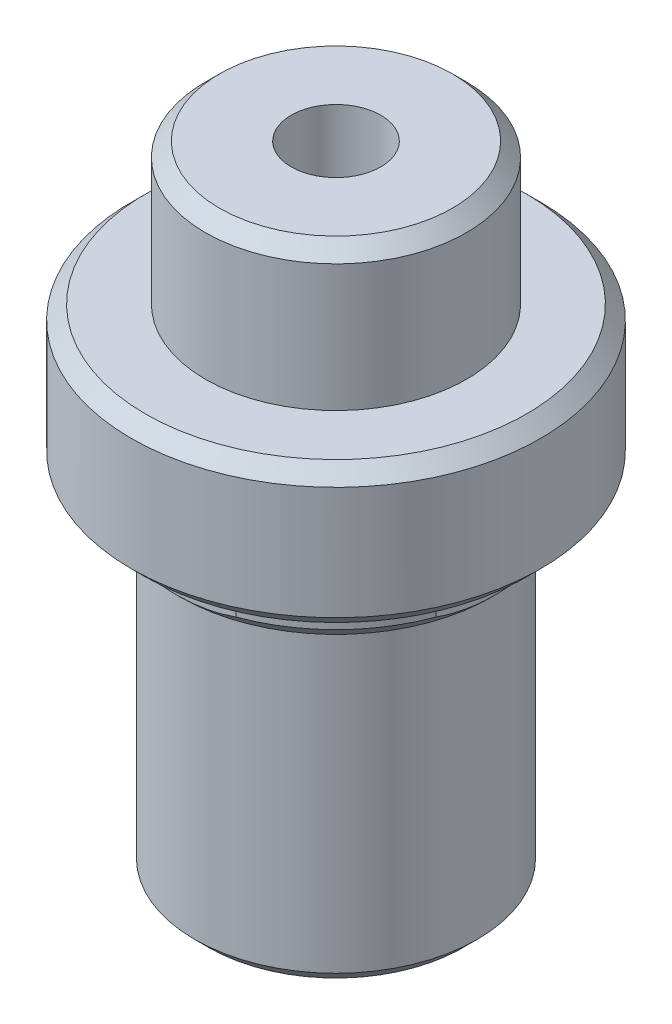
ISO-10303-21;
HEADER;
FILE_DESCRIPTION(('STEP AP214'),'2;1');
FILE_NAME('part.step','',(''),(''),'','','');
FILE_SCHEMA(('AUTOMOTIVE_DESIGN { 1 0 10303 214 1 1 1 1 }'));
ENDSEC;
DATA;
#1=APPLICATION_CONTEXT('core data for automotive mechanical design processes');
#2=APPLICATION_PROTOCOL_DEFINITION('international standard','automotive_design',2000,#1);
#3=PRODUCT_CONTEXT('',#1,'mechanical');
#4=PRODUCT('Part','Part','',(#3));
#5=PRODUCT_RELATED_PRODUCT_CATEGORY('part','',(#4));
#6=PRODUCT_DEFINITION_FORMATION('','',#4);
#7=PRODUCT_DEFINITION_CONTEXT('part definition',#1,'design');
#8=PRODUCT_DEFINITION('design','',#6,#7);
#9=PRODUCT_DEFINITION_SHAPE('','',#8);
#10=(LENGTH_UNIT() NAMED_UNIT(*) SI_UNIT(.MILLI.,.METRE.));
#11=(NAMED_UNIT(*) PLANE_ANGLE_UNIT() SI_UNIT($,.RADIAN.));
#12=(NAMED_UNIT(*) SI_UNIT($,.STERADIAN.) SOLID_ANGLE_UNIT());
#13=UNCERTAINTY_MEASURE_WITH_UNIT(LENGTH_MEASURE(1.E-05),#10,'distance_accuracy_value','');
#14=(GEOMETRIC_REPRESENTATION_CONTEXT(3) GLOBAL_UNCERTAINTY_ASSIGNED_CONTEXT((#13)) GLOBAL_UNIT_ASSIGNED_CONTEXT((#10,
#11,#12)) REPRESENTATION_CONTEXT('',''));
#15=CARTESIAN_POINT('',(0.,0.,0.));
#16=DIRECTION('',(0.,0.,1.));
#17=DIRECTION('',(1.,0.,0.));
#18=AXIS2_PLACEMENT_3D('',#15,#16,#17);
#19=CARTESIAN_POINT('',(0.,38.2504155517242,0.));
#20=DIRECTION('',(0.,1.,0.));
#21=DIRECTION('',(0.,0.,1.));
#22=AXIS2_PLACEMENT_3D('',#19,#20,#21);
#23=CYLINDRICAL_SURFACE('',#22,24.);
#24=CARTESIAN_POINT('',(0.,-23.,0.));
#25=DIRECTION('',(0.,1.,0.));
#26=DIRECTION('',(0.,0.,1.));
#27=AXIS2_PLACEMENT_3D('',#24,#25,#26);
#28=CIRCLE('',#27,24.);
#29=CARTESIAN_POINT('',(-22.5,-23.,8.35164654424505));
#30=VERTEX_POINT('',#29);
#31=CARTESIAN_POINT('',(-8.35164654424505,-23.,22.5));
#32=VERTEX_POINT('',#31);
#33=EDGE_CURVE('E127',#30,#32,#28,.T.);
#34=ORIENTED_EDGE('',*,*,#33,.T.);
#35=DIRECTION('',(0.,1.,0.));
#36=VECTOR('',#35,1.);
#37=CARTESIAN_POINT('',(-8.35164654424507,38.2504155517242,22.5));
#38=LINE('',#37,#36);
#39=CARTESIAN_POINT('',(-8.35164654424506,-20.,22.5));
#40=VERTEX_POINT('',#39);
#41=EDGE_CURVE('E48',#32,#40,#38,.T.);
#42=ORIENTED_EDGE('',*,*,#41,.T.);
#43=CARTESIAN_POINT('',(0.,-20.,0.));
#44=DIRECTION('',(0.,1.,0.));
#45=DIRECTION('',(0.,0.,1.));
#46=AXIS2_PLACEMENT_3D('',#43,#44,#45);
#47=CIRCLE('',#46,24.);
#48=CARTESIAN_POINT('',(-22.5,-20.,8.35164654424507));
#49=VERTEX_POINT('',#48);
#50=EDGE_CURVE('E128',#49,#40,#47,.T.);
#51=ORIENTED_EDGE('',*,*,#50,.F.);
#52=DIRECTION('',(0.,1.,0.));
#53=VECTOR('',#52,1.);
#54=CARTESIAN_POINT('',(-22.5,38.2504155517242,8.35164654424507));
#55=LINE('',#54,#53);
#56=EDGE_CURVE('E243',#49,#30,#55,.F.);
#57=ORIENTED_EDGE('',*,*,#56,.T.);
#58=EDGE_LOOP('',(#34,#42,#51,#57));
#59=FACE_BOUND('',#58,.T.);
#60=ADVANCED_FACE('F33',(#59),#23,.T.);
#61=CARTESIAN_POINT('',(-8.35164654424505,-23.,-22.5));
#62=VERTEX_POINT('',#61);
#63=CARTESIAN_POINT('',(-22.5,-23.,-8.35164654424505));
#64=VERTEX_POINT('',#63);
#65=EDGE_CURVE('E283',#62,#64,#28,.T.);
#66=ORIENTED_EDGE('',*,*,#65,.T.);
#67=DIRECTION('',(0.,1.,0.));
#68=VECTOR('',#67,1.);
#69=CARTESIAN_POINT('',(-22.5,38.2504155517242,-8.35164654424507));
#70=LINE('',#69,#68);
#71=CARTESIAN_POINT('',(-22.5,-20.,-8.35164654424506));
#72=VERTEX_POINT('',#71);
#73=EDGE_CURVE('E56',#64,#72,#70,.T.);
#74=ORIENTED_EDGE('',*,*,#73,.T.);
#75=CARTESIAN_POINT('',(-8.35164654424506,-20.,-22.5));
#76=VERTEX_POINT('',#75);
#77=EDGE_CURVE('E125',#76,#72,#47,.T.);
#78=ORIENTED_EDGE('',*,*,#77,.F.);
#79=DIRECTION('',(0.,1.,0.));
#80=VECTOR('',#79,1.);
#81=CARTESIAN_POINT('',(-8.35164654424507,38.2504155517242,-22.5));
#82=LINE('',#81,#80);
#83=EDGE_CURVE('E291',#76,#62,#82,.F.);
#84=ORIENTED_EDGE('',*,*,#83,.T.);
#85=EDGE_LOOP('',(#66,#74,#78,#84));
#86=FACE_BOUND('',#85,.T.);
#87=ADVANCED_FACE('F177',(#86),#23,.T.);
#88=CARTESIAN_POINT('',(22.5,-23.,-8.35164654424507));
#89=VERTEX_POINT('',#88);
#90=CARTESIAN_POINT('',(8.35164654424505,-23.,-22.5));
#91=VERTEX_POINT('',#90);
#92=EDGE_CURVE('E138',#89,#91,#28,.T.);
#93=ORIENTED_EDGE('',*,*,#92,.T.);
#94=DIRECTION('',(0.,1.,0.));
#95=VECTOR('',#94,1.);
#96=CARTESIAN_POINT('',(8.35164654424507,38.2504155517242,-22.5));
#97=LINE('',#96,#95);
#98=CARTESIAN_POINT('',(8.35164654424507,-20.,-22.5));
#99=VERTEX_POINT('',#98);
#100=EDGE_CURVE('E124',#91,#99,#97,.T.);
#101=ORIENTED_EDGE('',*,*,#100,.T.);
#102=CARTESIAN_POINT('',(22.5,-20.,-8.35164654424507));
#103=VERTEX_POINT('',#102);
#104=EDGE_CURVE('E117',#103,#99,#47,.T.);
#105=ORIENTED_EDGE('',*,*,#104,.F.);
#106=DIRECTION('',(0.,1.,0.));
#107=VECTOR('',#106,1.);
#108=CARTESIAN_POINT('',(22.5,38.2504155517242,-8.35164654424508));
#109=LINE('',#108,#107);
#110=EDGE_CURVE('E97',#103,#89,#109,.F.);
#111=ORIENTED_EDGE('',*,*,#110,.T.);
#112=EDGE_LOOP('',(#93,#101,#105,#111));
#113=FACE_BOUND('',#112,.T.);
#114=ADVANCED_FACE('F123',(#113),#23,.T.);
#115=CARTESIAN_POINT('',(18.5,0.,0.));
#116=DIRECTION('',(0.,-1.,0.));
#117=DIRECTION('',(0.,0.,-1.));
#118=AXIS2_PLACEMENT_3D('',#115,#116,#117);
#119=PLANE('',#118);
#120=CARTESIAN_POINT('',(0.,0.,0.));
#121=DIRECTION('',(0.,-1.,0.));
#122=DIRECTION('',(0.,0.,-1.));
#123=AXIS2_PLACEMENT_3D('',#120,#121,#122);
#124=CIRCLE('',#123,27.);
#125=CARTESIAN_POINT('',(0.,0.,-27.));
#126=VERTEX_POINT('',#125);
#127=EDGE_CURVE('E156',#126,#126,#124,.F.);
#128=ORIENTED_EDGE('',*,*,#127,.T.);
#129=EDGE_LOOP('',(#128));
#130=FACE_BOUND('',#129,.T.);
#131=CARTESIAN_POINT('',(0.,0.,0.));
#132=DIRECTION('',(0.,1.,0.));
#133=DIRECTION('',(0.,0.,1.));
#134=AXIS2_PLACEMENT_3D('',#131,#132,#133);
#135=CIRCLE('',#134,18.5);
#136=CARTESIAN_POINT('',(0.,0.,18.5));
#137=VERTEX_POINT('',#136);
#138=EDGE_CURVE('E264',#137,#137,#135,.T.);
#139=ORIENTED_EDGE('',*,*,#138,.F.);
#140=EDGE_LOOP('',(#139));
#141=FACE_BOUND('',#140,.T.);
#142=ADVANCED_FACE('F198',(#130,#141),#119,.F.);
#143=CARTESIAN_POINT('',(0.,38.2504155517242,0.));
#144=DIRECTION('',(0.,1.,0.));
#145=DIRECTION('',(0.,0.,1.));
#146=AXIS2_PLACEMENT_3D('',#143,#144,#145);
#147=CYLINDRICAL_SURFACE('',#146,29.);
#148=CARTESIAN_POINT('',(0.,-18.,0.));
#149=DIRECTION('',(0.,1.,0.));
#150=DIRECTION('',(0.,0.,1.));
#151=AXIS2_PLACEMENT_3D('',#148,#149,#150);
#152=CIRCLE('',#151,29.);
#153=CARTESIAN_POINT('',(0.,-18.,29.));
#154=VERTEX_POINT('',#153);
#155=EDGE_CURVE('E144',#154,#154,#152,.T.);
#156=ORIENTED_EDGE('',*,*,#155,.T.);
#157=EDGE_LOOP('',(#156));
#158=FACE_BOUND('',#157,.T.);
#159=CARTESIAN_POINT('',(0.,-2.,0.));
#160=DIRECTION('',(0.,-1.,0.));
#161=DIRECTION('',(0.,0.,-1.));
#162=AXIS2_PLACEMENT_3D('',#159,#160,#161);
#163=CIRCLE('',#162,29.);
#164=CARTESIAN_POINT('',(0.,-2.,-29.));
#165=VERTEX_POINT('',#164);
#166=EDGE_CURVE('E141',#165,#165,#163,.T.);
#167=ORIENTED_EDGE('',*,*,#166,.T.);
#168=EDGE_LOOP('',(#167));
#169=FACE_BOUND('',#168,.T.);
#170=ADVANCED_FACE('F196',(#158,#169),#147,.T.);
#171=CARTESIAN_POINT('',(29.,-20.,0.));
#172=DIRECTION('',(0.,1.,0.));
#173=DIRECTION('',(0.,0.,1.));
#174=AXIS2_PLACEMENT_3D('',#171,#172,#173);
#175=PLANE('',#174);
#176=DIRECTION('',(-1.,0.,0.));
#177=VECTOR('',#176,1.);
#178=CARTESIAN_POINT('',(22.5,-20.,22.5));
#179=LINE('',#178,#177);
#180=CARTESIAN_POINT('',(8.35164654424507,-20.,22.5));
#181=VERTEX_POINT('',#180);
#182=EDGE_CURVE('E279',#181,#40,#179,.T.);
#183=ORIENTED_EDGE('',*,*,#182,.F.);
#184=CARTESIAN_POINT('',(22.5,-20.,8.35164654424507));
#185=VERTEX_POINT('',#184);
#186=EDGE_CURVE('E119',#181,#185,#47,.T.);
#187=ORIENTED_EDGE('',*,*,#186,.T.);
#188=DIRECTION('',(0.,0.,1.));
#189=VECTOR('',#188,1.);
#190=CARTESIAN_POINT('',(22.5,-20.,22.5));
#191=LINE('',#190,#189);
#192=EDGE_CURVE('E100',#103,#185,#191,.T.);
#193=ORIENTED_EDGE('',*,*,#192,.F.);
#194=ORIENTED_EDGE('',*,*,#104,.T.);
#195=DIRECTION('',(1.,0.,0.));
#196=VECTOR('',#195,1.);
#197=CARTESIAN_POINT('',(22.5,-20.,-22.5));
#198=LINE('',#197,#196);
#199=EDGE_CURVE('E120',#76,#99,#198,.T.);
#200=ORIENTED_EDGE('',*,*,#199,.F.);
#201=ORIENTED_EDGE('',*,*,#77,.T.);
#202=DIRECTION('',(0.,0.,-1.));
#203=VECTOR('',#202,1.);
#204=CARTESIAN_POINT('',(-22.5,-20.,22.5));
#205=LINE('',#204,#203);
#206=EDGE_CURVE('E280',#49,#72,#205,.T.);
#207=ORIENTED_EDGE('',*,*,#206,.F.);
#208=ORIENTED_EDGE('',*,*,#50,.T.);
#209=EDGE_LOOP('',(#183,#187,#193,#194,#200,#201,#207,#208));
#210=FACE_BOUND('',#209,.T.);
#211=CARTESIAN_POINT('',(0.,-20.,0.));
#212=DIRECTION('',(0.,1.,0.));
#213=DIRECTION('',(0.,0.,1.));
#214=AXIS2_PLACEMENT_3D('',#211,#212,#213);
#215=CIRCLE('',#214,27.);
#216=CARTESIAN_POINT('',(0.,-20.,27.));
#217=VERTEX_POINT('',#216);
#218=EDGE_CURVE('E147',#217,#217,#215,.F.);
#219=ORIENTED_EDGE('',*,*,#218,.T.);
#220=EDGE_LOOP('',(#219));
#221=FACE_BOUND('',#220,.T.);
#222=ADVANCED_FACE('F114',(#210,#221),#175,.F.);
#223=ORIENTED_EDGE('',*,*,#186,.F.);
#224=DIRECTION('',(0.,1.,0.));
#225=VECTOR('',#224,1.);
#226=CARTESIAN_POINT('',(8.35164654424507,38.2504155517242,22.5));
#227=LINE('',#226,#225);
#228=CARTESIAN_POINT('',(8.35164654424505,-23.,22.5));
#229=VERTEX_POINT('',#228);
#230=EDGE_CURVE('E260',#181,#229,#227,.F.);
#231=ORIENTED_EDGE('',*,*,#230,.T.);
#232=CARTESIAN_POINT('',(22.5,-23.,8.35164654424506));
#233=VERTEX_POINT('',#232);
#234=EDGE_CURVE('E134',#229,#233,#28,.T.);
#235=ORIENTED_EDGE('',*,*,#234,.T.);
#236=DIRECTION('',(0.,1.,0.));
#237=VECTOR('',#236,1.);
#238=CARTESIAN_POINT('',(22.5,38.2504155517242,8.35164654424507));
#239=LINE('',#238,#237);
#240=EDGE_CURVE('E108',#233,#185,#239,.T.);
#241=ORIENTED_EDGE('',*,*,#240,.T.);
#242=EDGE_LOOP('',(#223,#231,#235,#241));
#243=FACE_BOUND('',#242,.T.);
#244=ADVANCED_FACE('F180',(#243),#23,.T.);
#245=CARTESIAN_POINT('',(24.,-25.,0.));
#246=DIRECTION('',(0.,1.,0.));
#247=DIRECTION('',(0.,0.,1.));
#248=AXIS2_PLACEMENT_3D('',#245,#246,#247);
#249=PLANE('',#248);
#250=CARTESIAN_POINT('',(0.,-25.,0.));
#251=DIRECTION('',(0.,1.,0.));
#252=DIRECTION('',(0.,0.,1.));
#253=AXIS2_PLACEMENT_3D('',#250,#251,#252);
#254=CIRCLE('',#253,22.);
#255=CARTESIAN_POINT('',(0.,-25.,22.));
#256=VERTEX_POINT('',#255);
#257=EDGE_CURVE('E137',#256,#256,#254,.F.);
#258=ORIENTED_EDGE('',*,*,#257,.T.);
#259=EDGE_LOOP('',(#258));
#260=FACE_BOUND('',#259,.T.);
#261=CARTESIAN_POINT('',(0.,-25.,0.));
#262=DIRECTION('',(0.,1.,0.));
#263=DIRECTION('',(0.,0.,1.));
#264=AXIS2_PLACEMENT_3D('',#261,#262,#263);
#265=CIRCLE('',#264,20.);
#266=CARTESIAN_POINT('',(0.,-25.,20.));
#267=VERTEX_POINT('',#266);
#268=EDGE_CURVE('E132',#267,#267,#265,.T.);
#269=ORIENTED_EDGE('',*,*,#268,.T.);
#270=EDGE_LOOP('',(#269));
#271=FACE_BOUND('',#270,.T.);
#272=ADVANCED_FACE('F189',(#260,#271),#249,.F.);
#273=CARTESIAN_POINT('',(0.,38.2504155517242,0.));
#274=DIRECTION('',(0.,1.,0.));
#275=DIRECTION('',(0.,0.,1.));
#276=AXIS2_PLACEMENT_3D('',#273,#274,#275);
#277=CYLINDRICAL_SURFACE('',#276,20.);
#278=CARTESIAN_POINT('',(0.,-68.,0.));
#279=DIRECTION('',(0.,1.,0.));
#280=DIRECTION('',(0.,0.,1.));
#281=AXIS2_PLACEMENT_3D('',#278,#279,#280);
#282=CIRCLE('',#281,20.);
#283=CARTESIAN_POINT('',(0.,-68.,20.));
#284=VERTEX_POINT('',#283);
#285=EDGE_CURVE('E41',#284,#284,#282,.T.);
#286=ORIENTED_EDGE('',*,*,#285,.T.);
#287=EDGE_LOOP('',(#286));
#288=FACE_BOUND('',#287,.T.);
#289=ORIENTED_EDGE('',*,*,#268,.F.);
#290=EDGE_LOOP('',(#289));
#291=FACE_BOUND('',#290,.T.);
#292=ADVANCED_FACE('F161',(#288,#291),#277,.T.);
#293=CARTESIAN_POINT('',(20.,-70.,0.));
#294=DIRECTION('',(0.,1.,0.));
#295=DIRECTION('',(0.,0.,1.));
#296=AXIS2_PLACEMENT_3D('',#293,#294,#295);
#297=PLANE('',#296);
#298=CARTESIAN_POINT('',(0.,-70.,0.));
#299=DIRECTION('',(0.,1.,0.));
#300=DIRECTION('',(0.,0.,1.));
#301=AXIS2_PLACEMENT_3D('',#298,#299,#300);
#302=CIRCLE('',#301,18.);
#303=CARTESIAN_POINT('',(0.,-70.,18.));
#304=VERTEX_POINT('',#303);
#305=EDGE_CURVE('E12',#304,#304,#302,.F.);
#306=ORIENTED_EDGE('',*,*,#305,.T.);
#307=EDGE_LOOP('',(#306));
#308=FACE_BOUND('',#307,.T.);
#309=CARTESIAN_POINT('',(0.,-70.,0.));
#310=DIRECTION('',(0.,1.,0.));
#311=DIRECTION('',(0.,0.,1.));
#312=AXIS2_PLACEMENT_3D('',#309,#310,#311);
#313=CIRCLE('',#312,6.35000000000001);
#314=CARTESIAN_POINT('',(0.,-70.,6.35000000000001));
#315=VERTEX_POINT('',#314);
#316=EDGE_CURVE('E269',#315,#315,#313,.T.);
#317=ORIENTED_EDGE('',*,*,#316,.T.);
#318=EDGE_LOOP('',(#317));
#319=FACE_BOUND('',#318,.T.);
#320=ADVANCED_FACE('F395',(#308,#319),#297,.F.);
#321=CARTESIAN_POINT('',(0.,38.2504155517242,0.));
#322=DIRECTION('',(0.,1.,0.));
#323=DIRECTION('',(0.,0.,1.));
#324=AXIS2_PLACEMENT_3D('',#321,#322,#323);
#325=CYLINDRICAL_SURFACE('',#324,6.35000000000001);
#326=ORIENTED_EDGE('',*,*,#316,.F.);
#327=EDGE_LOOP('',(#326));
#328=FACE_BOUND('',#327,.T.);
#329=CARTESIAN_POINT('',(0.,20.,0.));
#330=DIRECTION('',(0.,1.,0.));
#331=DIRECTION('',(0.,0.,1.));
#332=AXIS2_PLACEMENT_3D('',#329,#330,#331);
#333=CIRCLE('',#332,6.35);
#334=CARTESIAN_POINT('',(0.,20.,6.35));
#335=VERTEX_POINT('',#334);
#336=EDGE_CURVE('E267',#335,#335,#333,.T.);
#337=ORIENTED_EDGE('',*,*,#336,.T.);
#338=EDGE_LOOP('',(#337));
#339=FACE_BOUND('',#338,.T.);
#340=ADVANCED_FACE('F386',(#328,#339),#325,.F.);
#341=CARTESIAN_POINT('',(18.5,20.,0.));
#342=DIRECTION('',(0.,-1.,0.));
#343=DIRECTION('',(0.,0.,-1.));
#344=AXIS2_PLACEMENT_3D('',#341,#342,#343);
#345=PLANE('',#344);
#346=CARTESIAN_POINT('',(0.,20.,0.));
#347=DIRECTION('',(0.,-1.,0.));
#348=DIRECTION('',(0.,0.,-1.));
#349=AXIS2_PLACEMENT_3D('',#346,#347,#348);
#350=CIRCLE('',#349,16.5);
#351=CARTESIAN_POINT('',(0.,20.,-16.5));
#352=VERTEX_POINT('',#351);
#353=EDGE_CURVE('E150',#352,#352,#350,.F.);
#354=ORIENTED_EDGE('',*,*,#353,.T.);
#355=EDGE_LOOP('',(#354));
#356=FACE_BOUND('',#355,.T.);
#357=ORIENTED_EDGE('',*,*,#336,.F.);
#358=EDGE_LOOP('',(#357));
#359=FACE_BOUND('',#358,.T.);
#360=ADVANCED_FACE('F378',(#356,#359),#345,.F.);
#361=CARTESIAN_POINT('',(0.,38.2504155517242,0.));
#362=DIRECTION('',(0.,1.,0.));
#363=DIRECTION('',(0.,0.,1.));
#364=AXIS2_PLACEMENT_3D('',#361,#362,#363);
#365=CYLINDRICAL_SURFACE('',#364,18.5);
#366=CARTESIAN_POINT('',(0.,18.,0.));
#367=DIRECTION('',(0.,-1.,0.));
#368=DIRECTION('',(0.,0.,-1.));
#369=AXIS2_PLACEMENT_3D('',#366,#367,#368);
#370=CIRCLE('',#369,18.5);
#371=CARTESIAN_POINT('',(0.,18.,-18.5));
#372=VERTEX_POINT('',#371);
#373=EDGE_CURVE('E153',#372,#372,#370,.T.);
#374=ORIENTED_EDGE('',*,*,#373,.T.);
#375=EDGE_LOOP('',(#374));
#376=FACE_BOUND('',#375,.T.);
#377=ORIENTED_EDGE('',*,*,#138,.T.);
#378=EDGE_LOOP('',(#377));
#379=FACE_BOUND('',#378,.T.);
#380=ADVANCED_FACE('F216',(#376,#379),#365,.T.);
#381=CARTESIAN_POINT('',(0.,-23.,0.));
#382=DIRECTION('',(0.,1.,0.));
#383=DIRECTION('',(0.,0.,1.));
#384=AXIS2_PLACEMENT_3D('',#381,#382,#383);
#385=CONICAL_SURFACE('',#384,24.,0.785398163397447);
#386=CARTESIAN_POINT('',(-15.9474225557246,-19.421561208603,22.5));
#387=CARTESIAN_POINT('',(-15.5441616958929,-19.654717834168,22.5));
#388=CARTESIAN_POINT('',(-15.138351368261,-19.8835233484101,22.5));
#389=CARTESIAN_POINT('',(-14.3211321867447,-20.3311517845097,22.5));
#390=CARTESIAN_POINT('',(-13.9097219161934,-20.5499721170161,22.5));
#391=CARTESIAN_POINT('',(-13.0793554682314,-20.9770796427663,22.5));
#392=CARTESIAN_POINT('',(-12.6603757109975,-21.1853212636151,22.5));
#393=CARTESIAN_POINT('',(-11.8162171168862,-21.5886736563532,22.5));
#394=CARTESIAN_POINT('',(-11.3910387076603,-21.7837853289242,22.5));
#395=CARTESIAN_POINT('',(-10.092170918544,-22.3526980606216,22.5));
#396=CARTESIAN_POINT('',(-9.20797530947142,-22.7033524002016,22.5));
#397=CARTESIAN_POINT('',(-7.86189686472575,-23.1697082620276,22.5));
#398=CARTESIAN_POINT('',(-7.41020785978673,-23.3151470738479,22.5));
#399=CARTESIAN_POINT('',(-6.5003108574941,-23.5838706541361,22.5));
#400=CARTESIAN_POINT('',(-6.04210387002332,-23.7071588150894,22.5));
#401=CARTESIAN_POINT('',(-5.02097342893619,-23.9529816896216,22.5));
#402=CARTESIAN_POINT('',(-4.45663128002564,-24.0697052076643,22.5));
#403=CARTESIAN_POINT('',(-3.32103619542194,-24.2631062280958,22.5));
#404=CARTESIAN_POINT('',(-2.74978292531642,-24.3397817846673,22.5));
#405=CARTESIAN_POINT('',(-1.6078291329521,-24.4497243192446,22.5));
#406=CARTESIAN_POINT('',(-1.03716306765522,-24.4833448455699,22.5));
#407=CARTESIAN_POINT('',(0.105078963696198,-24.5070030698748,22.5));
#408=CARTESIAN_POINT('',(0.676654950369737,-24.4970397657691,22.5));
#409=CARTESIAN_POINT('',(1.90450301987357,-24.4290774552485,22.5));
#410=CARTESIAN_POINT('',(2.56038821431331,-24.3639795320554,22.5));
#411=CARTESIAN_POINT('',(3.86450606988731,-24.1796758462308,22.5));
#412=CARTESIAN_POINT('',(4.51273716978307,-24.060459233913,22.5));
#413=CARTESIAN_POINT('',(5.80615982682855,-23.7715911767705,22.5));
#414=CARTESIAN_POINT('',(6.45121456982356,-23.6013340337506,22.5));
#415=CARTESIAN_POINT('',(7.72803223340048,-23.2176206197606,22.5));
#416=CARTESIAN_POINT('',(8.35979787917189,-23.00417330303,22.5));
#417=CARTESIAN_POINT('',(9.79928736203335,-22.4703573528159,22.5));
#418=CARTESIAN_POINT('',(10.60224596659,-22.1371965073843,22.5));
#419=CARTESIAN_POINT('',(12.1861171541319,-21.4216546828632,22.5));
#420=CARTESIAN_POINT('',(12.9670174553623,-21.039246917707,22.5));
#421=CARTESIAN_POINT('',(14.5113278006179,-20.2344839840316,22.5));
#422=CARTESIAN_POINT('',(15.2746658068828,-19.8119916501419,22.5));
#423=CARTESIAN_POINT('',(16.783386030616,-18.9365949059687,22.5));
#424=CARTESIAN_POINT('',(17.5287715715768,-18.4836961844615,22.5));
#425=CARTESIAN_POINT('',(18.9693996082436,-17.5756812099162,22.5));
#426=CARTESIAN_POINT('',(19.6653480088507,-17.1216791596362,22.5));
#427=CARTESIAN_POINT('',(21.045339596218,-16.195867979536,22.5));
#428=CARTESIAN_POINT('',(21.7293818059876,-15.7240573983663,22.5));
#429=CARTESIAN_POINT('',(23.0813221736851,-14.7700438758726,22.5));
#430=CARTESIAN_POINT('',(23.7493087523486,-14.2879659433174,22.5));
#431=CARTESIAN_POINT('',(24.7446600376196,-13.5560502804662,22.5));
#432=CARTESIAN_POINT('',(25.0752971585477,-13.3106438913869,22.5));
#433=CARTESIAN_POINT('',(25.7345383358528,-12.8171277455712,22.5));
#434=CARTESIAN_POINT('',(26.0631424307725,-12.5690180403329,22.5));
#435=CARTESIAN_POINT('',(26.3908098246762,-12.3196764259296,22.5));
#436=B_SPLINE_CURVE_WITH_KNOTS('',3,(#386,#387,#388,#389,#390,#391,#392,#393,#394,#395,#396,
#397,#398,#399,#400,#401,#402,#403,#404,#405,#406,#407,#408,#409,#410,#411,#412,#413,#414,#415,
#416,#417,#418,#419,#420,#421,#422,#423,#424,#425,#426,#427,#428,#429,#430,#431,#432,#433,#434,
#435),.UNSPECIFIED.,.F.,.F.,(4,2,2,2,2,2,2,2,2,2,2,2,2,2,2,2,2,2,2,2,2,2,2,2,4),(0.,
1.39745047725473,2.79526130470776,4.19865640072799,5.60195512900777,8.45192543442395,
9.8750536886861,11.2979637974364,13.0254790935732,14.753078316989,16.4663983530606,
18.1797577822296,20.1546018179466,22.1298419443231,24.1295183481742,26.128780600657,
28.7345798280059,31.3418024187865,33.9582926515193,36.5742947180485,39.0667895330605,
41.5594879204618,44.0306496215019,45.2659144393497,46.5011557664577),.UNSPECIFIED.);
#437=EDGE_CURVE('E255',#32,#229,#436,.T.);
#438=ORIENTED_EDGE('',*,*,#437,.F.);
#439=ORIENTED_EDGE('',*,*,#33,.F.);
#440=CARTESIAN_POINT('',(-22.5,-19.421561208603,-15.9474225557246));
#441=CARTESIAN_POINT('',(-22.5,-19.654717834168,-15.5441616958929));
#442=CARTESIAN_POINT('',(-22.5,-19.8835233484101,-15.138351368261));
#443=CARTESIAN_POINT('',(-22.5,-20.3311517845097,-14.3211321867447));
#444=CARTESIAN_POINT('',(-22.5,-20.5499721170161,-13.9097219161934));
#445=CARTESIAN_POINT('',(-22.5,-20.9770796427663,-13.0793554682314));
#446=CARTESIAN_POINT('',(-22.5,-21.1853212636151,-12.6603757109975));
#447=CARTESIAN_POINT('',(-22.5,-21.5886736563532,-11.8162171168862));
#448=CARTESIAN_POINT('',(-22.5,-21.7837853289242,-11.3910387076603));
#449=CARTESIAN_POINT('',(-22.5,-22.3526980606216,-10.0921709185439));
#450=CARTESIAN_POINT('',(-22.5,-22.7033524002016,-9.20797530947141));
#451=CARTESIAN_POINT('',(-22.5,-23.1697082620276,-7.86189686472574));
#452=CARTESIAN_POINT('',(-22.5,-23.3151470738479,-7.41020785978673));
#453=CARTESIAN_POINT('',(-22.5,-23.5838706541361,-6.5003108574941));
#454=CARTESIAN_POINT('',(-22.5,-23.7071588150894,-6.04210387002332));
#455=CARTESIAN_POINT('',(-22.5,-23.9529816896216,-5.02097342893618));
#456=CARTESIAN_POINT('',(-22.5,-24.0697052076643,-4.45663128002564));
#457=CARTESIAN_POINT('',(-22.5,-24.2631062280958,-3.32103619542194));
#458=CARTESIAN_POINT('',(-22.5,-24.3397817846673,-2.74978292531642));
#459=CARTESIAN_POINT('',(-22.5,-24.4497243192446,-1.60782913295209));
#460=CARTESIAN_POINT('',(-22.5,-24.4833448455699,-1.03716306765522));
#461=CARTESIAN_POINT('',(-22.5,-24.5070030698748,0.105078963696199));
#462=CARTESIAN_POINT('',(-22.5,-24.4970397657691,0.676654950369738));
#463=CARTESIAN_POINT('',(-22.5,-24.4290774552485,1.90450301987357));
#464=CARTESIAN_POINT('',(-22.5,-24.3639795320554,2.56038821431331));
#465=CARTESIAN_POINT('',(-22.5,-24.1796758462308,3.86450606988731));
#466=CARTESIAN_POINT('',(-22.5,-24.060459233913,4.51273716978307));
#467=CARTESIAN_POINT('',(-22.5,-23.7715911767705,5.80615982682855));
#468=CARTESIAN_POINT('',(-22.5,-23.6013340337506,6.45121456982356));
#469=CARTESIAN_POINT('',(-22.5,-23.2176206197606,7.72803223340048));
#470=CARTESIAN_POINT('',(-22.5,-23.00417330303,8.35979787917189));
#471=CARTESIAN_POINT('',(-22.5,-22.4703573528159,9.79928736203335));
#472=CARTESIAN_POINT('',(-22.5,-22.1371965073843,10.60224596659));
#473=CARTESIAN_POINT('',(-22.5,-21.4216546828632,12.1861171541319));
#474=CARTESIAN_POINT('',(-22.5,-21.039246917707,12.9670174553623));
#475=CARTESIAN_POINT('',(-22.5,-20.2344839840316,14.5113278006179));
#476=CARTESIAN_POINT('',(-22.5,-19.8119916501419,15.2746658068828));
#477=CARTESIAN_POINT('',(-22.5,-18.9365949059687,16.783386030616));
#478=CARTESIAN_POINT('',(-22.5,-18.4836961844615,17.5287715715768));
#479=CARTESIAN_POINT('',(-22.5,-17.5756812099162,18.9693996082436));
#480=CARTESIAN_POINT('',(-22.5,-17.1216791596362,19.6653480088507));
#481=CARTESIAN_POINT('',(-22.5,-16.195867979536,21.045339596218));
#482=CARTESIAN_POINT('',(-22.5,-15.7240573983663,21.7293818059876));
#483=CARTESIAN_POINT('',(-22.5,-14.7700438758726,23.0813221736851));
#484=CARTESIAN_POINT('',(-22.5,-14.2879659433174,23.7493087523487));
#485=CARTESIAN_POINT('',(-22.5,-13.5560502804662,24.7446600376196));
#486=CARTESIAN_POINT('',(-22.5,-13.3106438913869,25.0752971585477));
#487=CARTESIAN_POINT('',(-22.5,-12.8171277455712,25.7345383358528));
#488=CARTESIAN_POINT('',(-22.5,-12.5690180403329,26.0631424307725));
#489=CARTESIAN_POINT('',(-22.5,-12.3196764259296,26.3908098246762));
#490=B_SPLINE_CURVE_WITH_KNOTS('',3,(#440,#441,#442,#443,#444,#445,#446,#447,#448,#449,#450,
#451,#452,#453,#454,#455,#456,#457,#458,#459,#460,#461,#462,#463,#464,#465,#466,#467,#468,#469,
#470,#471,#472,#473,#474,#475,#476,#477,#478,#479,#480,#481,#482,#483,#484,#485,#486,#487,#488,
#489),.UNSPECIFIED.,.F.,.F.,(4,2,2,2,2,2,2,2,2,2,2,2,2,2,2,2,2,2,2,2,2,2,2,2,4),(0.,
1.39745047725474,2.79526130470776,4.19865640072799,5.60195512900777,8.45192543442394,
9.87505368868609,11.2979637974364,13.0254790935732,14.753078316989,16.4663983530606,
18.1797577822296,20.1546018179466,22.1298419443231,24.1295183481742,26.128780600657,
28.7345798280058,31.3418024187865,33.9582926515193,36.5742947180485,39.0667895330605,
41.5594879204617,44.0306496215019,45.2659144393497,46.5011557664577),.UNSPECIFIED.);
#491=EDGE_CURVE('E236',#64,#30,#490,.T.);
#492=ORIENTED_EDGE('',*,*,#491,.F.);
#493=ORIENTED_EDGE('',*,*,#65,.F.);
#494=CARTESIAN_POINT('',(-15.9474225557246,-19.421561208603,-22.5));
#495=CARTESIAN_POINT('',(-15.5441616958929,-19.654717834168,-22.5));
#496=CARTESIAN_POINT('',(-15.138351368261,-19.8835233484101,-22.5));
#497=CARTESIAN_POINT('',(-14.3211321867447,-20.3311517845097,-22.5));
#498=CARTESIAN_POINT('',(-13.9097219161934,-20.5499721170161,-22.5));
#499=CARTESIAN_POINT('',(-13.0793554682314,-20.9770796427663,-22.5));
#500=CARTESIAN_POINT('',(-12.6603757109975,-21.1853212636151,-22.5));
#501=CARTESIAN_POINT('',(-11.8162171168862,-21.5886736563532,-22.5));
#502=CARTESIAN_POINT('',(-11.3910387076603,-21.7837853289242,-22.5));
#503=CARTESIAN_POINT('',(-10.092170918544,-22.3526980606216,-22.5));
#504=CARTESIAN_POINT('',(-9.20797530947141,-22.7033524002016,-22.5));
#505=CARTESIAN_POINT('',(-7.86189686472575,-23.1697082620276,-22.5));
#506=CARTESIAN_POINT('',(-7.41020785978673,-23.3151470738479,-22.5));
#507=CARTESIAN_POINT('',(-6.5003108574941,-23.5838706541361,-22.5));
#508=CARTESIAN_POINT('',(-6.04210387002332,-23.7071588150894,-22.5));
#509=CARTESIAN_POINT('',(-5.02097342893619,-23.9529816896216,-22.5));
#510=CARTESIAN_POINT('',(-4.45663128002564,-24.0697052076643,-22.5));
#511=CARTESIAN_POINT('',(-3.32103619542194,-24.2631062280958,-22.5));
#512=CARTESIAN_POINT('',(-2.74978292531642,-24.3397817846673,-22.5));
#513=CARTESIAN_POINT('',(-1.6078291329521,-24.4497243192446,-22.5));
#514=CARTESIAN_POINT('',(-1.03716306765523,-24.4833448455699,-22.5));
#515=CARTESIAN_POINT('',(0.105078963696194,-24.5070030698748,-22.5));
#516=CARTESIAN_POINT('',(0.676654950369734,-24.4970397657691,-22.5));
#517=CARTESIAN_POINT('',(1.90450301987357,-24.4290774552485,-22.5));
#518=CARTESIAN_POINT('',(2.56038821431331,-24.3639795320554,-22.5));
#519=CARTESIAN_POINT('',(3.86450606988731,-24.1796758462308,-22.5));
#520=CARTESIAN_POINT('',(4.51273716978306,-24.060459233913,-22.5));
#521=CARTESIAN_POINT('',(5.80615982682854,-23.7715911767705,-22.5));
#522=CARTESIAN_POINT('',(6.45121456982356,-23.6013340337506,-22.5));
#523=CARTESIAN_POINT('',(7.72803223340048,-23.2176206197606,-22.5));
#524=CARTESIAN_POINT('',(8.35979787917189,-23.00417330303,-22.5));
#525=CARTESIAN_POINT('',(9.79928736203335,-22.4703573528159,-22.5));
#526=CARTESIAN_POINT('',(10.60224596659,-22.1371965073843,-22.5));
#527=CARTESIAN_POINT('',(12.1861171541319,-21.4216546828632,-22.5));
#528=CARTESIAN_POINT('',(12.9670174553623,-21.039246917707,-22.5));
#529=CARTESIAN_POINT('',(14.5113278006179,-20.2344839840316,-22.5));
#530=CARTESIAN_POINT('',(15.2746658068828,-19.8119916501419,-22.5));
#531=CARTESIAN_POINT('',(16.783386030616,-18.9365949059687,-22.5));
#532=CARTESIAN_POINT('',(17.5287715715768,-18.4836961844615,-22.5));
#533=CARTESIAN_POINT('',(18.9693996082436,-17.5756812099162,-22.5));
#534=CARTESIAN_POINT('',(19.6653480088507,-17.1216791596361,-22.5));
#535=CARTESIAN_POINT('',(21.045339596218,-16.1958679795359,-22.5));
#536=CARTESIAN_POINT('',(21.7293818059876,-15.7240573983663,-22.5));
#537=CARTESIAN_POINT('',(23.0813221736851,-14.7700438758726,-22.5));
#538=CARTESIAN_POINT('',(23.7493087523486,-14.2879659433174,-22.5));
#539=CARTESIAN_POINT('',(24.7446600376196,-13.5560502804662,-22.5));
#540=CARTESIAN_POINT('',(25.0752971585477,-13.3106438913869,-22.5));
#541=CARTESIAN_POINT('',(25.7345383358528,-12.8171277455712,-22.5));
#542=CARTESIAN_POINT('',(26.0631424307725,-12.5690180403329,-22.5));
#543=CARTESIAN_POINT('',(26.3908098246762,-12.3196764259296,-22.5));
#544=B_SPLINE_CURVE_WITH_KNOTS('',3,(#494,#495,#496,#497,#498,#499,#500,#501,#502,#503,#504,
#505,#506,#507,#508,#509,#510,#511,#512,#513,#514,#515,#516,#517,#518,#519,#520,#521,#522,#523,
#524,#525,#526,#527,#528,#529,#530,#531,#532,#533,#534,#535,#536,#537,#538,#539,#540,#541,#542,
#543),.UNSPECIFIED.,.F.,.F.,(4,2,2,2,2,2,2,2,2,2,2,2,2,2,2,2,2,2,2,2,2,2,2,2,4),(0.,
1.39745047725474,2.79526130470776,4.19865640072799,5.60195512900777,8.45192543442395,
9.8750536886861,11.2979637974364,13.0254790935732,14.753078316989,16.4663983530606,
18.1797577822296,20.1546018179466,22.1298419443231,24.1295183481742,26.128780600657,
28.7345798280059,31.3418024187865,33.9582926515193,36.5742947180485,39.0667895330605,
41.5594879204618,44.0306496215019,45.2659144393497,46.5011557664577),.UNSPECIFIED.);
#545=EDGE_CURVE('E228',#91,#62,#544,.F.);
#546=ORIENTED_EDGE('',*,*,#545,.F.);
#547=ORIENTED_EDGE('',*,*,#92,.F.);
#548=CARTESIAN_POINT('',(22.5,-19.421561208603,-15.9474225557246));
#549=CARTESIAN_POINT('',(22.5,-19.654717834168,-15.5441616958929));
#550=CARTESIAN_POINT('',(22.5,-19.8835233484101,-15.138351368261));
#551=CARTESIAN_POINT('',(22.5,-20.3311517845097,-14.3211321867447));
#552=CARTESIAN_POINT('',(22.5,-20.5499721170161,-13.9097219161934));
#553=CARTESIAN_POINT('',(22.5,-20.9770796427663,-13.0793554682314));
#554=CARTESIAN_POINT('',(22.5,-21.1853212636151,-12.6603757109975));
#555=CARTESIAN_POINT('',(22.5,-21.5886736563532,-11.8162171168862));
#556=CARTESIAN_POINT('',(22.5,-21.7837853289242,-11.3910387076603));
#557=CARTESIAN_POINT('',(22.5,-22.3526980606216,-10.0921709185439));
#558=CARTESIAN_POINT('',(22.5,-22.7033524002017,-9.20797530947141));
#559=CARTESIAN_POINT('',(22.5,-23.1697082620276,-7.86189686472574));
#560=CARTESIAN_POINT('',(22.5,-23.3151470738479,-7.41020785978673));
#561=CARTESIAN_POINT('',(22.5,-23.5838706541361,-6.50031085749409));
#562=CARTESIAN_POINT('',(22.5,-23.7071588150894,-6.04210387002331));
#563=CARTESIAN_POINT('',(22.5,-23.9529816896216,-5.02097342893618));
#564=CARTESIAN_POINT('',(22.5,-24.0697052076643,-4.45663128002564));
#565=CARTESIAN_POINT('',(22.5,-24.2631062280958,-3.32103619542194));
#566=CARTESIAN_POINT('',(22.5,-24.3397817846673,-2.74978292531642));
#567=CARTESIAN_POINT('',(22.5,-24.4497243192446,-1.60782913295209));
#568=CARTESIAN_POINT('',(22.5,-24.4833448455699,-1.03716306765522));
#569=CARTESIAN_POINT('',(22.5,-24.5070030698748,0.105078963696196));
#570=CARTESIAN_POINT('',(22.5,-24.4970397657691,0.676654950369735));
#571=CARTESIAN_POINT('',(22.5,-24.4290774552485,1.90450301987357));
#572=CARTESIAN_POINT('',(22.5,-24.3639795320554,2.56038821431331));
#573=CARTESIAN_POINT('',(22.5,-24.1796758462308,3.86450606988731));
#574=CARTESIAN_POINT('',(22.5,-24.060459233913,4.51273716978306));
#575=CARTESIAN_POINT('',(22.5,-23.7715911767705,5.80615982682855));
#576=CARTESIAN_POINT('',(22.5,-23.6013340337506,6.45121456982356));
#577=CARTESIAN_POINT('',(22.5,-23.2176206197606,7.72803223340048));
#578=CARTESIAN_POINT('',(22.5,-23.00417330303,8.35979787917189));
#579=CARTESIAN_POINT('',(22.5,-22.4703573528159,9.79928736203334));
#580=CARTESIAN_POINT('',(22.5,-22.1371965073844,10.60224596659));
#581=CARTESIAN_POINT('',(22.5,-21.4216546828632,12.1861171541319));
#582=CARTESIAN_POINT('',(22.5,-21.039246917707,12.9670174553623));
#583=CARTESIAN_POINT('',(22.5,-20.2344839840316,14.5113278006179));
#584=CARTESIAN_POINT('',(22.5,-19.8119916501419,15.2746658068828));
#585=CARTESIAN_POINT('',(22.5,-18.9365949059687,16.783386030616));
#586=CARTESIAN_POINT('',(22.5,-18.4836961844615,17.5287715715768));
#587=CARTESIAN_POINT('',(22.5,-17.5756812099162,18.9693996082436));
#588=CARTESIAN_POINT('',(22.5,-17.1216791596361,19.6653480088507));
#589=CARTESIAN_POINT('',(22.5,-16.1958679795359,21.045339596218));
#590=CARTESIAN_POINT('',(22.5,-15.7240573983663,21.7293818059876));
#591=CARTESIAN_POINT('',(22.5,-14.7700438758726,23.0813221736851));
#592=CARTESIAN_POINT('',(22.5,-14.2879659433174,23.7493087523487));
#593=CARTESIAN_POINT('',(22.5,-13.5560502804662,24.7446600376196));
#594=CARTESIAN_POINT('',(22.5,-13.3106438913869,25.0752971585477));
#595=CARTESIAN_POINT('',(22.5,-12.8171277455712,25.7345383358528));
#596=CARTESIAN_POINT('',(22.5,-12.5690180403328,26.0631424307725));
#597=CARTESIAN_POINT('',(22.5,-12.3196764259296,26.3908098246762));
#598=B_SPLINE_CURVE_WITH_KNOTS('',3,(#548,#549,#550,#551,#552,#553,#554,#555,#556,#557,#558,
#559,#560,#561,#562,#563,#564,#565,#566,#567,#568,#569,#570,#571,#572,#573,#574,#575,#576,#577,
#578,#579,#580,#581,#582,#583,#584,#585,#586,#587,#588,#589,#590,#591,#592,#593,#594,#595,#596,
#597),.UNSPECIFIED.,.F.,.F.,(4,2,2,2,2,2,2,2,2,2,2,2,2,2,2,2,2,2,2,2,2,2,2,2,4),(0.,
1.39745047725473,2.79526130470776,4.19865640072799,5.60195512900777,8.45192543442394,
9.87505368868609,11.2979637974364,13.0254790935732,14.753078316989,16.4663983530606,
18.1797577822296,20.1546018179466,22.1298419443231,24.1295183481742,26.128780600657,
28.7345798280058,31.3418024187865,33.9582926515193,36.5742947180485,39.0667895330605,
41.5594879204618,44.0306496215019,45.2659144393497,46.5011557664577),.UNSPECIFIED.);
#599=EDGE_CURVE('E103',#233,#89,#598,.F.);
#600=ORIENTED_EDGE('',*,*,#599,.F.);
#601=ORIENTED_EDGE('',*,*,#234,.F.);
#602=EDGE_LOOP('',(#438,#439,#492,#493,#546,#547,#600,#601));
#603=FACE_BOUND('',#602,.T.);
#604=ORIENTED_EDGE('',*,*,#257,.F.);
#605=EDGE_LOOP('',(#604));
#606=FACE_BOUND('',#605,.T.);
#607=ADVANCED_FACE('F211',(#603,#606),#385,.T.);
#608=CARTESIAN_POINT('',(0.,-18.,0.));
#609=DIRECTION('',(0.,1.,0.));
#610=DIRECTION('',(0.,0.,1.));
#611=AXIS2_PLACEMENT_3D('',#608,#609,#610);
#612=CONICAL_SURFACE('',#611,29.,0.785398163397447);
#613=ORIENTED_EDGE('',*,*,#218,.F.);
#614=EDGE_LOOP('',(#613));
#615=FACE_BOUND('',#614,.T.);
#616=ORIENTED_EDGE('',*,*,#155,.F.);
#617=EDGE_LOOP('',(#616));
#618=FACE_BOUND('',#617,.T.);
#619=ADVANCED_FACE('F215',(#615,#618),#612,.T.);
#620=CARTESIAN_POINT('',(0.,20.,0.));
#621=DIRECTION('',(0.,-1.,0.));
#622=DIRECTION('',(0.,0.,-1.));
#623=AXIS2_PLACEMENT_3D('',#620,#621,#622);
#624=CONICAL_SURFACE('',#623,16.5,0.785398163397447);
#625=ORIENTED_EDGE('',*,*,#373,.F.);
#626=EDGE_LOOP('',(#625));
#627=FACE_BOUND('',#626,.T.);
#628=ORIENTED_EDGE('',*,*,#353,.F.);
#629=EDGE_LOOP('',(#628));
#630=FACE_BOUND('',#629,.T.);
#631=ADVANCED_FACE('F173',(#627,#630),#624,.T.);
#632=CARTESIAN_POINT('',(0.,0.,0.));
#633=DIRECTION('',(0.,-1.,0.));
#634=DIRECTION('',(0.,0.,-1.));
#635=AXIS2_PLACEMENT_3D('',#632,#633,#634);
#636=CONICAL_SURFACE('',#635,27.,0.785398163397448);
#637=ORIENTED_EDGE('',*,*,#166,.F.);
#638=EDGE_LOOP('',(#637));
#639=FACE_BOUND('',#638,.T.);
#640=ORIENTED_EDGE('',*,*,#127,.F.);
#641=EDGE_LOOP('',(#640));
#642=FACE_BOUND('',#641,.T.);
#643=ADVANCED_FACE('F165',(#639,#642),#636,.T.);
#644=CARTESIAN_POINT('',(0.,-68.,0.));
#645=DIRECTION('',(0.,1.,0.));
#646=DIRECTION('',(0.,0.,1.));
#647=AXIS2_PLACEMENT_3D('',#644,#645,#646);
#648=CONICAL_SURFACE('',#647,20.,0.78539816339745);
#649=ORIENTED_EDGE('',*,*,#305,.F.);
#650=EDGE_LOOP('',(#649));
#651=FACE_BOUND('',#650,.T.);
#652=ORIENTED_EDGE('',*,*,#285,.F.);
#653=EDGE_LOOP('',(#652));
#654=FACE_BOUND('',#653,.T.);
#655=ADVANCED_FACE('F35',(#651,#654),#648,.T.);
#656=CARTESIAN_POINT('',(22.5,-70.,22.5));
#657=DIRECTION('',(-1.,0.,0.));
#658=DIRECTION('',(0.,0.,1.));
#659=AXIS2_PLACEMENT_3D('',#656,#657,#658);
#660=PLANE('',#659);
#661=ORIENTED_EDGE('',*,*,#599,.T.);
#662=ORIENTED_EDGE('',*,*,#110,.F.);
#663=ORIENTED_EDGE('',*,*,#192,.T.);
#664=ORIENTED_EDGE('',*,*,#240,.F.);
#665=EDGE_LOOP('',(#661,#662,#663,#664));
#666=FACE_BOUND('',#665,.T.);
#667=ADVANCED_FACE('F99',(#666),#660,.F.);
#668=CARTESIAN_POINT('',(22.5,-70.,-22.5));
#669=DIRECTION('',(0.,0.,1.));
#670=DIRECTION('',(1.,0.,0.));
#671=AXIS2_PLACEMENT_3D('',#668,#669,#670);
#672=PLANE('',#671);
#673=ORIENTED_EDGE('',*,*,#545,.T.);
#674=ORIENTED_EDGE('',*,*,#83,.F.);
#675=ORIENTED_EDGE('',*,*,#199,.T.);
#676=ORIENTED_EDGE('',*,*,#100,.F.);
#677=EDGE_LOOP('',(#673,#674,#675,#676));
#678=FACE_BOUND('',#677,.T.);
#679=ADVANCED_FACE('F171',(#678),#672,.F.);
#680=CARTESIAN_POINT('',(-22.5,-70.,22.5));
#681=DIRECTION('',(1.,0.,0.));
#682=DIRECTION('',(0.,0.,-1.));
#683=AXIS2_PLACEMENT_3D('',#680,#681,#682);
#684=PLANE('',#683);
#685=ORIENTED_EDGE('',*,*,#491,.T.);
#686=ORIENTED_EDGE('',*,*,#56,.F.);
#687=ORIENTED_EDGE('',*,*,#206,.T.);
#688=ORIENTED_EDGE('',*,*,#73,.F.);
#689=EDGE_LOOP('',(#685,#686,#687,#688));
#690=FACE_BOUND('',#689,.T.);
#691=ADVANCED_FACE('F245',(#690),#684,.F.);
#692=CARTESIAN_POINT('',(22.5,-70.,22.5));
#693=DIRECTION('',(0.,0.,-1.));
#694=DIRECTION('',(-1.,0.,0.));
#695=AXIS2_PLACEMENT_3D('',#692,#693,#694);
#696=PLANE('',#695);
#697=ORIENTED_EDGE('',*,*,#437,.T.);
#698=ORIENTED_EDGE('',*,*,#230,.F.);
#699=ORIENTED_EDGE('',*,*,#182,.T.);
#700=ORIENTED_EDGE('',*,*,#41,.F.);
#701=EDGE_LOOP('',(#697,#698,#699,#700));
#702=FACE_BOUND('',#701,.T.);
#703=ADVANCED_FACE('F249',(#702),#696,.F.);
#704=CLOSED_SHELL('',(#60,#87,#114,#142,#170,#222,#244,#272,#292,#320,#340,#360,#380,#607,#619,
#631,#643,#655,#667,#679,#691,#703));
#705=MANIFOLD_SOLID_BREP('B2',#704);
#706=ADVANCED_BREP_SHAPE_REPRESENTATION('',(#18,#705),#14);
#707=SHAPE_DEFINITION_REPRESENTATION(#9,#706);
ENDSEC;
END-ISO-10303-21;
